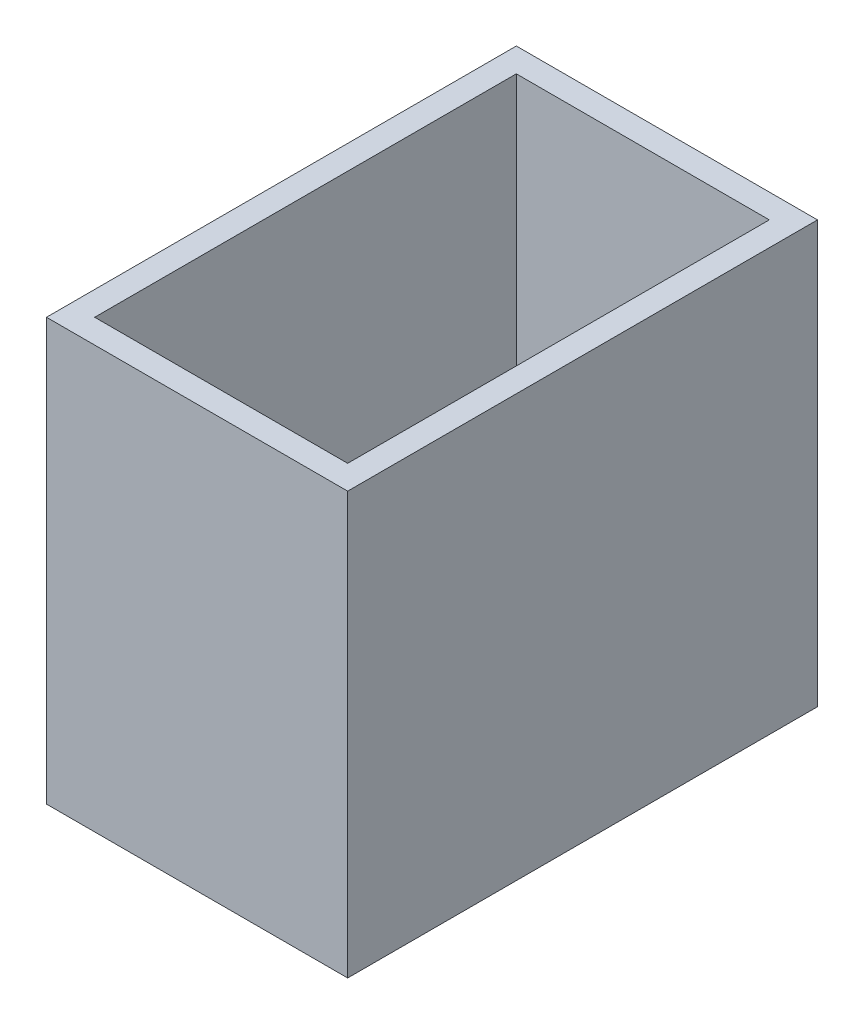
ISO-10303-21;
HEADER;
FILE_DESCRIPTION(('STEP AP214'),'2;1');
FILE_NAME('part.step','',(''),(''),'','','');
FILE_SCHEMA(('AUTOMOTIVE_DESIGN { 1 0 10303 214 1 1 1 1 }'));
ENDSEC;
DATA;
#1=APPLICATION_CONTEXT('core data for automotive mechanical design processes');
#2=APPLICATION_PROTOCOL_DEFINITION('international standard','automotive_design',2000,#1);
#3=PRODUCT_CONTEXT('',#1,'mechanical');
#4=PRODUCT('Part','Part','',(#3));
#5=PRODUCT_RELATED_PRODUCT_CATEGORY('part','',(#4));
#6=PRODUCT_DEFINITION_FORMATION('','',#4);
#7=PRODUCT_DEFINITION_CONTEXT('part definition',#1,'design');
#8=PRODUCT_DEFINITION('design','',#6,#7);
#9=PRODUCT_DEFINITION_SHAPE('','',#8);
#10=(LENGTH_UNIT() NAMED_UNIT(*) SI_UNIT(.MILLI.,.METRE.));
#11=(NAMED_UNIT(*) PLANE_ANGLE_UNIT() SI_UNIT($,.RADIAN.));
#12=(NAMED_UNIT(*) SI_UNIT($,.STERADIAN.) SOLID_ANGLE_UNIT());
#13=UNCERTAINTY_MEASURE_WITH_UNIT(LENGTH_MEASURE(1.E-05),#10,'distance_accuracy_value','');
#14=(GEOMETRIC_REPRESENTATION_CONTEXT(3) GLOBAL_UNCERTAINTY_ASSIGNED_CONTEXT((#13)) GLOBAL_UNIT_ASSIGNED_CONTEXT((#10,
#11,#12)) REPRESENTATION_CONTEXT('',''));
#15=CARTESIAN_POINT('',(0.,0.,0.));
#16=DIRECTION('',(0.,0.,1.));
#17=DIRECTION('',(1.,0.,0.));
#18=AXIS2_PLACEMENT_3D('',#15,#16,#17);
#19=CARTESIAN_POINT('',(0.,30.,0.));
#20=DIRECTION('',(0.,1.,0.));
#21=DIRECTION('',(0.,0.,1.));
#22=AXIS2_PLACEMENT_3D('',#19,#20,#21);
#23=PLANE('',#22);
#24=DIRECTION('',(1.,0.,0.));
#25=VECTOR('',#24,1.);
#26=CARTESIAN_POINT('',(-12.5,30.,19.5));
#27=LINE('',#26,#25);
#28=CARTESIAN_POINT('',(-12.5,30.,19.5));
#29=VERTEX_POINT('',#28);
#30=CARTESIAN_POINT('',(12.5,30.,19.5));
#31=VERTEX_POINT('',#30);
#32=EDGE_CURVE('E115',#29,#31,#27,.T.);
#33=ORIENTED_EDGE('',*,*,#32,.T.);
#34=DIRECTION('',(0.,0.,-1.));
#35=VECTOR('',#34,1.);
#36=CARTESIAN_POINT('',(12.5,30.,19.5));
#37=LINE('',#36,#35);
#38=CARTESIAN_POINT('',(12.5,30.,-19.5));
#39=VERTEX_POINT('',#38);
#40=EDGE_CURVE('E185',#31,#39,#37,.T.);
#41=ORIENTED_EDGE('',*,*,#40,.T.);
#42=DIRECTION('',(-1.,0.,0.));
#43=VECTOR('',#42,1.);
#44=CARTESIAN_POINT('',(-12.5,30.,-19.5));
#45=LINE('',#44,#43);
#46=CARTESIAN_POINT('',(-12.5,30.,-19.5));
#47=VERTEX_POINT('',#46);
#48=EDGE_CURVE('E188',#39,#47,#45,.T.);
#49=ORIENTED_EDGE('',*,*,#48,.T.);
#50=DIRECTION('',(0.,0.,1.));
#51=VECTOR('',#50,1.);
#52=CARTESIAN_POINT('',(-12.5,30.,19.5));
#53=LINE('',#52,#51);
#54=EDGE_CURVE('E68',#47,#29,#53,.T.);
#55=ORIENTED_EDGE('',*,*,#54,.T.);
#56=EDGE_LOOP('',(#33,#41,#49,#55));
#57=FACE_BOUND('',#56,.T.);
#58=DIRECTION('',(-1.,0.,0.));
#59=VECTOR('',#58,1.);
#60=CARTESIAN_POINT('',(-10.5,30.,-17.5));
#61=LINE('',#60,#59);
#62=CARTESIAN_POINT('',(10.5,30.,-17.5));
#63=VERTEX_POINT('',#62);
#64=CARTESIAN_POINT('',(-10.5,30.,-17.5));
#65=VERTEX_POINT('',#64);
#66=EDGE_CURVE('E147',#63,#65,#61,.T.);
#67=ORIENTED_EDGE('',*,*,#66,.F.);
#68=DIRECTION('',(0.,0.,-1.));
#69=VECTOR('',#68,1.);
#70=CARTESIAN_POINT('',(10.5,30.,17.5));
#71=LINE('',#70,#69);
#72=CARTESIAN_POINT('',(10.5,30.,17.5));
#73=VERTEX_POINT('',#72);
#74=EDGE_CURVE('E144',#73,#63,#71,.T.);
#75=ORIENTED_EDGE('',*,*,#74,.F.);
#76=DIRECTION('',(1.,0.,0.));
#77=VECTOR('',#76,1.);
#78=CARTESIAN_POINT('',(-10.5,30.,17.5));
#79=LINE('',#78,#77);
#80=CARTESIAN_POINT('',(-10.5,30.,17.5));
#81=VERTEX_POINT('',#80);
#82=EDGE_CURVE('E154',#81,#73,#79,.T.);
#83=ORIENTED_EDGE('',*,*,#82,.F.);
#84=DIRECTION('',(0.,0.,1.));
#85=VECTOR('',#84,1.);
#86=CARTESIAN_POINT('',(-10.5,30.,17.5));
#87=LINE('',#86,#85);
#88=EDGE_CURVE('E151',#65,#81,#87,.T.);
#89=ORIENTED_EDGE('',*,*,#88,.F.);
#90=EDGE_LOOP('',(#67,#75,#83,#89));
#91=FACE_BOUND('',#90,.T.);
#92=ADVANCED_FACE('F44',(#57,#91),#23,.T.);
#93=CARTESIAN_POINT('',(-12.5,30.,19.5));
#94=DIRECTION('',(0.,0.,-1.));
#95=DIRECTION('',(-1.,0.,0.));
#96=AXIS2_PLACEMENT_3D('',#93,#94,#95);
#97=PLANE('',#96);
#98=DIRECTION('',(0.,-1.,0.));
#99=VECTOR('',#98,1.);
#100=CARTESIAN_POINT('',(-12.5,30.,19.5));
#101=LINE('',#100,#99);
#102=CARTESIAN_POINT('',(-12.5,-5.,19.5));
#103=VERTEX_POINT('',#102);
#104=EDGE_CURVE('E110',#29,#103,#101,.T.);
#105=ORIENTED_EDGE('',*,*,#104,.T.);
#106=DIRECTION('',(1.,0.,0.));
#107=VECTOR('',#106,1.);
#108=CARTESIAN_POINT('',(0.,-5.,19.5));
#109=LINE('',#108,#107);
#110=CARTESIAN_POINT('',(12.5,-5.,19.5));
#111=VERTEX_POINT('',#110);
#112=EDGE_CURVE('E114',#103,#111,#109,.T.);
#113=ORIENTED_EDGE('',*,*,#112,.T.);
#114=DIRECTION('',(0.,-1.,0.));
#115=VECTOR('',#114,1.);
#116=CARTESIAN_POINT('',(12.5,30.,19.5));
#117=LINE('',#116,#115);
#118=EDGE_CURVE('E11',#31,#111,#117,.T.);
#119=ORIENTED_EDGE('',*,*,#118,.F.);
#120=ORIENTED_EDGE('',*,*,#32,.F.);
#121=EDGE_LOOP('',(#105,#113,#119,#120));
#122=FACE_BOUND('',#121,.T.);
#123=ADVANCED_FACE('F46',(#122),#97,.F.);
#124=CARTESIAN_POINT('',(12.5,30.,19.5));
#125=DIRECTION('',(-1.,0.,0.));
#126=DIRECTION('',(0.,0.,1.));
#127=AXIS2_PLACEMENT_3D('',#124,#125,#126);
#128=PLANE('',#127);
#129=ORIENTED_EDGE('',*,*,#118,.T.);
#130=DIRECTION('',(0.,0.,-1.));
#131=VECTOR('',#130,1.);
#132=CARTESIAN_POINT('',(12.5,-5.,0.));
#133=LINE('',#132,#131);
#134=CARTESIAN_POINT('',(12.5,-5.,-19.5));
#135=VERTEX_POINT('',#134);
#136=EDGE_CURVE('E133',#111,#135,#133,.T.);
#137=ORIENTED_EDGE('',*,*,#136,.T.);
#138=DIRECTION('',(0.,-1.,0.));
#139=VECTOR('',#138,1.);
#140=CARTESIAN_POINT('',(12.5,30.,-19.5));
#141=LINE('',#140,#139);
#142=EDGE_CURVE('E53',#39,#135,#141,.T.);
#143=ORIENTED_EDGE('',*,*,#142,.F.);
#144=ORIENTED_EDGE('',*,*,#40,.F.);
#145=EDGE_LOOP('',(#129,#137,#143,#144));
#146=FACE_BOUND('',#145,.T.);
#147=ADVANCED_FACE('F200',(#146),#128,.F.);
#148=CARTESIAN_POINT('',(-12.5,30.,-19.5));
#149=DIRECTION('',(0.,0.,1.));
#150=DIRECTION('',(1.,0.,0.));
#151=AXIS2_PLACEMENT_3D('',#148,#149,#150);
#152=PLANE('',#151);
#153=ORIENTED_EDGE('',*,*,#142,.T.);
#154=DIRECTION('',(1.,0.,0.));
#155=VECTOR('',#154,1.);
#156=CARTESIAN_POINT('',(0.,-5.,-19.5));
#157=LINE('',#156,#155);
#158=CARTESIAN_POINT('',(-12.5,-5.,-19.5));
#159=VERTEX_POINT('',#158);
#160=EDGE_CURVE('E137',#159,#135,#157,.T.);
#161=ORIENTED_EDGE('',*,*,#160,.F.);
#162=DIRECTION('',(0.,-1.,0.));
#163=VECTOR('',#162,1.);
#164=CARTESIAN_POINT('',(-12.5,30.,-19.5));
#165=LINE('',#164,#163);
#166=EDGE_CURVE('E118',#47,#159,#165,.T.);
#167=ORIENTED_EDGE('',*,*,#166,.F.);
#168=ORIENTED_EDGE('',*,*,#48,.F.);
#169=EDGE_LOOP('',(#153,#161,#167,#168));
#170=FACE_BOUND('',#169,.T.);
#171=ADVANCED_FACE('F198',(#170),#152,.F.);
#172=CARTESIAN_POINT('',(-12.5,30.,19.5));
#173=DIRECTION('',(1.,0.,0.));
#174=DIRECTION('',(0.,0.,-1.));
#175=AXIS2_PLACEMENT_3D('',#172,#173,#174);
#176=PLANE('',#175);
#177=ORIENTED_EDGE('',*,*,#166,.T.);
#178=DIRECTION('',(0.,0.,-1.));
#179=VECTOR('',#178,1.);
#180=CARTESIAN_POINT('',(-12.5,-5.,0.));
#181=LINE('',#180,#179);
#182=EDGE_CURVE('E121',#103,#159,#181,.T.);
#183=ORIENTED_EDGE('',*,*,#182,.F.);
#184=ORIENTED_EDGE('',*,*,#104,.F.);
#185=ORIENTED_EDGE('',*,*,#54,.F.);
#186=EDGE_LOOP('',(#177,#183,#184,#185));
#187=FACE_BOUND('',#186,.T.);
#188=ADVANCED_FACE('F122',(#187),#176,.F.);
#189=CARTESIAN_POINT('',(10.5,30.,17.5));
#190=DIRECTION('',(-1.,0.,0.));
#191=DIRECTION('',(0.,0.,1.));
#192=AXIS2_PLACEMENT_3D('',#189,#190,#191);
#193=PLANE('',#192);
#194=DIRECTION('',(0.,0.,-1.));
#195=VECTOR('',#194,1.);
#196=CARTESIAN_POINT('',(10.5,0.,17.5));
#197=LINE('',#196,#195);
#198=CARTESIAN_POINT('',(10.5,0.,17.5));
#199=VERTEX_POINT('',#198);
#200=CARTESIAN_POINT('',(10.5,0.,-17.5));
#201=VERTEX_POINT('',#200);
#202=EDGE_CURVE('E143',#199,#201,#197,.T.);
#203=ORIENTED_EDGE('',*,*,#202,.F.);
#204=DIRECTION('',(0.,-1.,0.));
#205=VECTOR('',#204,1.);
#206=CARTESIAN_POINT('',(10.5,30.,17.5));
#207=LINE('',#206,#205);
#208=EDGE_CURVE('E157',#73,#199,#207,.T.);
#209=ORIENTED_EDGE('',*,*,#208,.F.);
#210=ORIENTED_EDGE('',*,*,#74,.T.);
#211=DIRECTION('',(0.,-1.,0.));
#212=VECTOR('',#211,1.);
#213=CARTESIAN_POINT('',(10.5,30.,-17.5));
#214=LINE('',#213,#212);
#215=EDGE_CURVE('E179',#63,#201,#214,.T.);
#216=ORIENTED_EDGE('',*,*,#215,.T.);
#217=EDGE_LOOP('',(#203,#209,#210,#216));
#218=FACE_BOUND('',#217,.T.);
#219=ADVANCED_FACE('F219',(#218),#193,.T.);
#220=CARTESIAN_POINT('',(-10.5,30.,-17.5));
#221=DIRECTION('',(0.,0.,1.));
#222=DIRECTION('',(1.,0.,0.));
#223=AXIS2_PLACEMENT_3D('',#220,#221,#222);
#224=PLANE('',#223);
#225=DIRECTION('',(-1.,0.,0.));
#226=VECTOR('',#225,1.);
#227=CARTESIAN_POINT('',(-10.5,0.,-17.5));
#228=LINE('',#227,#226);
#229=CARTESIAN_POINT('',(-10.5,0.,-17.5));
#230=VERTEX_POINT('',#229);
#231=EDGE_CURVE('E161',#201,#230,#228,.T.);
#232=ORIENTED_EDGE('',*,*,#231,.F.);
#233=ORIENTED_EDGE('',*,*,#215,.F.);
#234=ORIENTED_EDGE('',*,*,#66,.T.);
#235=DIRECTION('',(0.,-1.,0.));
#236=VECTOR('',#235,1.);
#237=CARTESIAN_POINT('',(-10.5,30.,-17.5));
#238=LINE('',#237,#236);
#239=EDGE_CURVE('E176',#65,#230,#238,.T.);
#240=ORIENTED_EDGE('',*,*,#239,.T.);
#241=EDGE_LOOP('',(#232,#233,#234,#240));
#242=FACE_BOUND('',#241,.T.);
#243=ADVANCED_FACE('F211',(#242),#224,.T.);
#244=CARTESIAN_POINT('',(-10.5,30.,17.5));
#245=DIRECTION('',(1.,0.,0.));
#246=DIRECTION('',(0.,0.,-1.));
#247=AXIS2_PLACEMENT_3D('',#244,#245,#246);
#248=PLANE('',#247);
#249=DIRECTION('',(0.,0.,1.));
#250=VECTOR('',#249,1.);
#251=CARTESIAN_POINT('',(-10.5,0.,17.5));
#252=LINE('',#251,#250);
#253=CARTESIAN_POINT('',(-10.5,0.,17.5));
#254=VERTEX_POINT('',#253);
#255=EDGE_CURVE('E165',#230,#254,#252,.T.);
#256=ORIENTED_EDGE('',*,*,#255,.F.);
#257=ORIENTED_EDGE('',*,*,#239,.F.);
#258=ORIENTED_EDGE('',*,*,#88,.T.);
#259=DIRECTION('',(0.,-1.,0.));
#260=VECTOR('',#259,1.);
#261=CARTESIAN_POINT('',(-10.5,30.,17.5));
#262=LINE('',#261,#260);
#263=EDGE_CURVE('E60',#81,#254,#262,.T.);
#264=ORIENTED_EDGE('',*,*,#263,.T.);
#265=EDGE_LOOP('',(#256,#257,#258,#264));
#266=FACE_BOUND('',#265,.T.);
#267=ADVANCED_FACE('F214',(#266),#248,.T.);
#268=CARTESIAN_POINT('',(-10.5,30.,17.5));
#269=DIRECTION('',(0.,0.,-1.));
#270=DIRECTION('',(-1.,0.,0.));
#271=AXIS2_PLACEMENT_3D('',#268,#269,#270);
#272=PLANE('',#271);
#273=DIRECTION('',(1.,0.,0.));
#274=VECTOR('',#273,1.);
#275=CARTESIAN_POINT('',(-10.5,0.,17.5));
#276=LINE('',#275,#274);
#277=EDGE_CURVE('E148',#254,#199,#276,.T.);
#278=ORIENTED_EDGE('',*,*,#277,.F.);
#279=ORIENTED_EDGE('',*,*,#263,.F.);
#280=ORIENTED_EDGE('',*,*,#82,.T.);
#281=ORIENTED_EDGE('',*,*,#208,.T.);
#282=EDGE_LOOP('',(#278,#279,#280,#281));
#283=FACE_BOUND('',#282,.T.);
#284=ADVANCED_FACE('F221',(#283),#272,.T.);
#285=CARTESIAN_POINT('',(0.,0.,0.));
#286=DIRECTION('',(0.,1.,0.));
#287=DIRECTION('',(0.,0.,1.));
#288=AXIS2_PLACEMENT_3D('',#285,#286,#287);
#289=PLANE('',#288);
#290=CARTESIAN_POINT('',(0.,0.,0.));
#291=DIRECTION('',(0.,1.,0.));
#292=DIRECTION('',(0.,0.,1.));
#293=AXIS2_PLACEMENT_3D('',#290,#291,#292);
#294=CIRCLE('',#293,2.75);
#295=CARTESIAN_POINT('',(0.,0.,2.75));
#296=VERTEX_POINT('',#295);
#297=EDGE_CURVE('E128',#296,#296,#294,.T.);
#298=ORIENTED_EDGE('',*,*,#297,.F.);
#299=EDGE_LOOP('',(#298));
#300=FACE_BOUND('',#299,.T.);
#301=ORIENTED_EDGE('',*,*,#277,.T.);
#302=ORIENTED_EDGE('',*,*,#202,.T.);
#303=ORIENTED_EDGE('',*,*,#231,.T.);
#304=ORIENTED_EDGE('',*,*,#255,.T.);
#305=EDGE_LOOP('',(#301,#302,#303,#304));
#306=FACE_BOUND('',#305,.T.);
#307=ADVANCED_FACE('F216',(#300,#306),#289,.T.);
#308=CARTESIAN_POINT('',(0.,-5.,0.));
#309=DIRECTION('',(0.,1.,0.));
#310=DIRECTION('',(0.,0.,1.));
#311=AXIS2_PLACEMENT_3D('',#308,#309,#310);
#312=PLANE('',#311);
#313=CARTESIAN_POINT('',(0.,-5.,0.));
#314=DIRECTION('',(0.,1.,0.));
#315=DIRECTION('',(0.,0.,1.));
#316=AXIS2_PLACEMENT_3D('',#313,#314,#315);
#317=CIRCLE('',#316,2.75);
#318=CARTESIAN_POINT('',(0.,-5.,2.75));
#319=VERTEX_POINT('',#318);
#320=EDGE_CURVE('E333',#319,#319,#317,.T.);
#321=ORIENTED_EDGE('',*,*,#320,.T.);
#322=EDGE_LOOP('',(#321));
#323=FACE_BOUND('',#322,.T.);
#324=ORIENTED_EDGE('',*,*,#182,.T.);
#325=ORIENTED_EDGE('',*,*,#160,.T.);
#326=ORIENTED_EDGE('',*,*,#136,.F.);
#327=ORIENTED_EDGE('',*,*,#112,.F.);
#328=EDGE_LOOP('',(#324,#325,#326,#327));
#329=FACE_BOUND('',#328,.T.);
#330=ADVANCED_FACE('F131',(#323,#329),#312,.F.);
#331=CARTESIAN_POINT('',(0.,-5.,0.));
#332=DIRECTION('',(0.,1.,0.));
#333=DIRECTION('',(0.,0.,1.));
#334=AXIS2_PLACEMENT_3D('',#331,#332,#333);
#335=CYLINDRICAL_SURFACE('',#334,2.75);
#336=ORIENTED_EDGE('',*,*,#297,.T.);
#337=EDGE_LOOP('',(#336));
#338=FACE_BOUND('',#337,.T.);
#339=ORIENTED_EDGE('',*,*,#320,.F.);
#340=EDGE_LOOP('',(#339));
#341=FACE_BOUND('',#340,.T.);
#342=ADVANCED_FACE('F314',(#338,#341),#335,.F.);
#343=CLOSED_SHELL('',(#92,#123,#147,#171,#188,#219,#243,#267,#284,#307,#330,#342));
#344=MANIFOLD_SOLID_BREP('B2',#343);
#345=ADVANCED_BREP_SHAPE_REPRESENTATION('',(#18,#344),#14);
#346=SHAPE_DEFINITION_REPRESENTATION(#9,#345);
ENDSEC;
END-ISO-10303-21;
